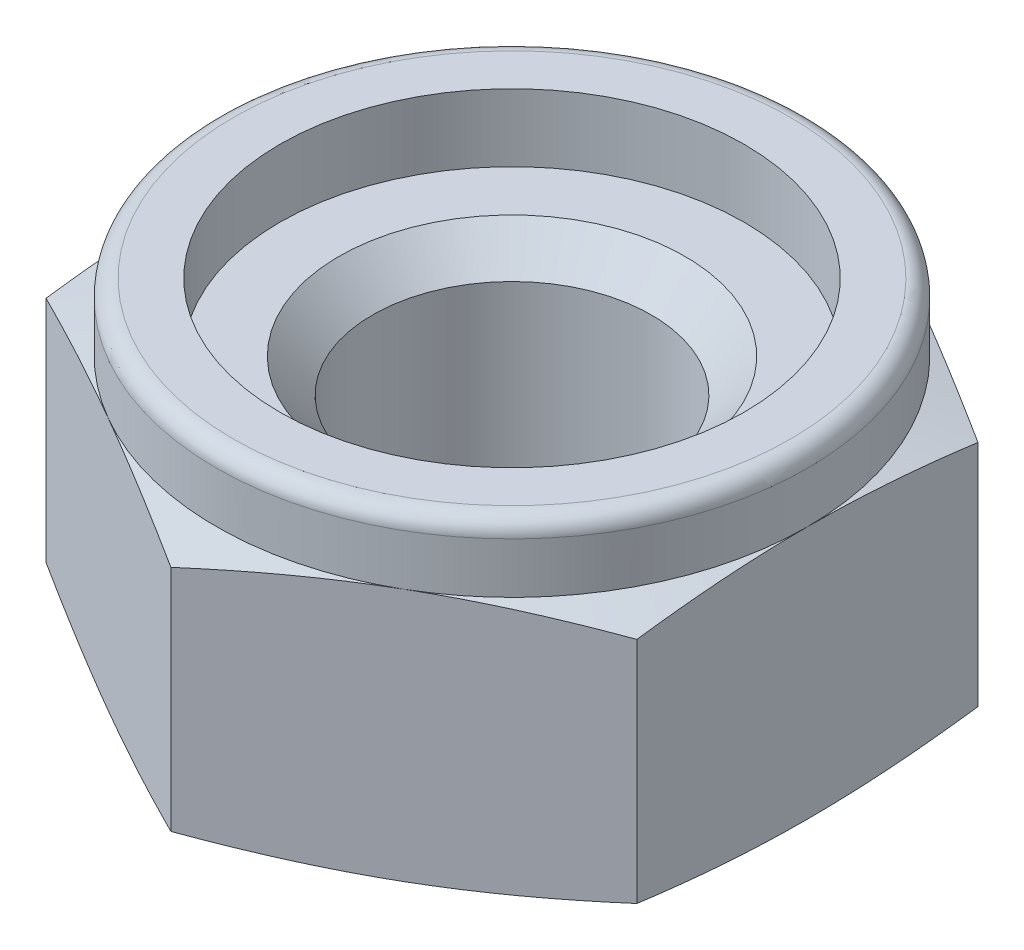
ISO-10303-21;
HEADER;
FILE_DESCRIPTION(('STEP AP214'),'2;1');
FILE_NAME('part.step','',(''),(''),'','','');
FILE_SCHEMA(('AUTOMOTIVE_DESIGN { 1 0 10303 214 1 1 1 1 }'));
ENDSEC;
DATA;
#1=APPLICATION_CONTEXT('core data for automotive mechanical design processes');
#2=APPLICATION_PROTOCOL_DEFINITION('international standard','automotive_design',2000,#1);
#3=PRODUCT_CONTEXT('',#1,'mechanical');
#4=PRODUCT('Part','Part','',(#3));
#5=PRODUCT_RELATED_PRODUCT_CATEGORY('part','',(#4));
#6=PRODUCT_DEFINITION_FORMATION('','',#4);
#7=PRODUCT_DEFINITION_CONTEXT('part definition',#1,'design');
#8=PRODUCT_DEFINITION('design','',#6,#7);
#9=PRODUCT_DEFINITION_SHAPE('','',#8);
#10=(LENGTH_UNIT() NAMED_UNIT(*) SI_UNIT(.MILLI.,.METRE.));
#11=(NAMED_UNIT(*) PLANE_ANGLE_UNIT() SI_UNIT($,.RADIAN.));
#12=(NAMED_UNIT(*) SI_UNIT($,.STERADIAN.) SOLID_ANGLE_UNIT());
#13=UNCERTAINTY_MEASURE_WITH_UNIT(LENGTH_MEASURE(1.E-05),#10,'distance_accuracy_value','');
#14=(GEOMETRIC_REPRESENTATION_CONTEXT(3) GLOBAL_UNCERTAINTY_ASSIGNED_CONTEXT((#13)) GLOBAL_UNIT_ASSIGNED_CONTEXT((#10,
#11,#12)) REPRESENTATION_CONTEXT('',''));
#15=CARTESIAN_POINT('',(0.,0.,0.));
#16=DIRECTION('',(0.,0.,1.));
#17=DIRECTION('',(1.,0.,0.));
#18=AXIS2_PLACEMENT_3D('',#15,#16,#17);
#19=CARTESIAN_POINT('',(3.5,-3.,-2.02072594216369));
#20=DIRECTION('',(0.5,0.,-0.866025403784438));
#21=DIRECTION('',(-0.866025403784439,0.,-0.5));
#22=AXIS2_PLACEMENT_3D('',#19,#20,#21);
#23=PLANE('',#22);
#24=DIRECTION('',(0.,1.,0.));
#25=VECTOR('',#24,1.);
#26=CARTESIAN_POINT('',(3.5,-3.,-2.02072594216369));
#27=LINE('',#26,#25);
#28=CARTESIAN_POINT('',(3.5,-2.85491840485417,-2.0207259421637));
#29=VERTEX_POINT('',#28);
#30=CARTESIAN_POINT('',(3.5,-0.145081595145828,-2.0207259421637));
#31=VERTEX_POINT('',#30);
#32=EDGE_CURVE('E159',#29,#31,#27,.T.);
#33=ORIENTED_EDGE('',*,*,#32,.F.);
#34=CARTESIAN_POINT('',(3.5002,-2.85488746342053,-2.02061047210985));
#35=CARTESIAN_POINT('',(3.35483723490565,-2.87738559382201,-2.10453570366722));
#36=CARTESIAN_POINT('',(3.20921089440683,-2.89781025450598,-2.18861311055532));
#37=CARTESIAN_POINT('',(2.91744387601656,-2.93369455339474,-2.3570648771636));
#38=CARTESIAN_POINT('',(2.77130301347336,-2.94915217450553,-2.44143934349252));
#39=CARTESIAN_POINT('',(2.47939308754756,-2.97419991225359,-2.6099736178049));
#40=CARTESIAN_POINT('',(2.33362599845102,-2.98381990209048,-2.69413228593378));
#41=CARTESIAN_POINT('',(2.04190591193726,-2.99671933246686,-2.86255695641052));
#42=CARTESIAN_POINT('',(1.89595295596863,-3.,-2.94682293482803));
#43=CARTESIAN_POINT('',(1.60404704403137,-3.,-3.11535489166305));
#44=CARTESIAN_POINT('',(1.45809408806274,-2.99671933246686,-3.19962087008056));
#45=CARTESIAN_POINT('',(1.16637400154898,-2.98381990209048,-3.3680455405573));
#46=CARTESIAN_POINT('',(1.02060691245245,-2.97419991225358,-3.45220420868617));
#47=CARTESIAN_POINT('',(0.728696986526637,-2.94915217450553,-3.62073848299856));
#48=CARTESIAN_POINT('',(0.582556123983439,-2.93369455339474,-3.70511294932748));
#49=CARTESIAN_POINT('',(0.290789105593174,-2.89781025450598,-3.87356471593575));
#50=CARTESIAN_POINT('',(0.145162765094348,-2.87738559382201,-3.95764212282385));
#51=CARTESIAN_POINT('',(-0.000199999999998899,-2.85488746342053,-4.04156735438122));
#52=B_SPLINE_CURVE_WITH_KNOTS('',3,(#34,#35,#36,#37,#38,#39,#40,#41,#42,#43,#44,#45,#46,#47,#48,
#49,#50,#51),.UNSPECIFIED.,.F.,.F.,(4,2,2,2,2,2,2,2,4),(0.,0.508081243376833,1.01636855642799,
1.52203235492776,2.02759827097034,2.53316418701292,3.03882798551268,3.54711529856384,
4.05519654194067),.UNSPECIFIED.);
#53=CARTESIAN_POINT('',(1.75,-3.,-3.03108891324554));
#54=VERTEX_POINT('',#53);
#55=EDGE_CURVE('E272',#29,#54,#52,.T.);
#56=ORIENTED_EDGE('',*,*,#55,.T.);
#57=CARTESIAN_POINT('',(0.,-2.85491840485417,-4.04145188432738));
#58=VERTEX_POINT('',#57);
#59=EDGE_CURVE('E57',#54,#58,#52,.T.);
#60=ORIENTED_EDGE('',*,*,#59,.T.);
#61=DIRECTION('',(0.,1.,0.));
#62=VECTOR('',#61,1.);
#63=CARTESIAN_POINT('',(0.,-3.,-4.04145188432738));
#64=LINE('',#63,#62);
#65=CARTESIAN_POINT('',(0.,-0.145081595145828,-4.04145188432738));
#66=VERTEX_POINT('',#65);
#67=EDGE_CURVE('E390',#58,#66,#64,.T.);
#68=ORIENTED_EDGE('',*,*,#67,.T.);
#69=CARTESIAN_POINT('',(-0.000200000000000184,-0.145112536579471,-4.04156735438122));
#70=CARTESIAN_POINT('',(0.145162765094346,-0.122614406177986,-3.95764212282385));
#71=CARTESIAN_POINT('',(0.290789105593173,-0.102189745494022,-3.87356471593576));
#72=CARTESIAN_POINT('',(0.582556123983438,-0.0663054466052643,-3.70511294932748));
#73=CARTESIAN_POINT('',(0.728696986526637,-0.0508478254944742,-3.62073848299856));
#74=CARTESIAN_POINT('',(1.02060691245244,-0.0258000877464157,-3.45220420868617));
#75=CARTESIAN_POINT('',(1.16637400154898,-0.0161800979095195,-3.3680455405573));
#76=CARTESIAN_POINT('',(1.45809408806274,-0.00328066753313903,-3.19962087008056));
#77=CARTESIAN_POINT('',(1.60404704403137,0.,-3.11535489166305));
#78=CARTESIAN_POINT('',(1.89595295596863,0.,-2.94682293482803));
#79=CARTESIAN_POINT('',(2.04190591193726,-0.00328066753313876,-2.86255695641052));
#80=CARTESIAN_POINT('',(2.33362599845102,-0.0161800979095192,-2.69413228593378));
#81=CARTESIAN_POINT('',(2.47939308754755,-0.0258000877464156,-2.6099736178049));
#82=CARTESIAN_POINT('',(2.77130301347336,-0.050847825494474,-2.44143934349252));
#83=CARTESIAN_POINT('',(2.91744387601656,-0.0663054466052638,-2.3570648771636));
#84=CARTESIAN_POINT('',(3.20921089440683,-0.102189745494021,-2.18861311055532));
#85=CARTESIAN_POINT('',(3.35483723490565,-0.122614406177985,-2.10453570366722));
#86=CARTESIAN_POINT('',(3.5002,-0.14511253657947,-2.02061047210985));
#87=B_SPLINE_CURVE_WITH_KNOTS('',3,(#69,#70,#71,#72,#73,#74,#75,#76,#77,#78,#79,#80,#81,#82,#83,
#84,#85,#86),.UNSPECIFIED.,.F.,.F.,(4,2,2,2,2,2,2,2,4),(0.,0.508081243376833,1.01636855642799,
1.52203235492776,2.02759827097034,2.53316418701292,3.03882798551268,3.54711529856384,
4.05519654194067),.UNSPECIFIED.);
#88=CARTESIAN_POINT('',(1.75,0.,-3.03108891324554));
#89=VERTEX_POINT('',#88);
#90=EDGE_CURVE('E394',#66,#89,#87,.T.);
#91=ORIENTED_EDGE('',*,*,#90,.T.);
#92=EDGE_CURVE('E236',#89,#31,#87,.T.);
#93=ORIENTED_EDGE('',*,*,#92,.T.);
#94=EDGE_LOOP('',(#33,#56,#60,#68,#91,#93));
#95=FACE_BOUND('',#94,.T.);
#96=ADVANCED_FACE('F34',(#95),#23,.T.);
#97=CARTESIAN_POINT('',(3.5,-3.,2.02072594216369));
#98=DIRECTION('',(1.,0.,0.));
#99=DIRECTION('',(0.,0.,-1.));
#100=AXIS2_PLACEMENT_3D('',#97,#98,#99);
#101=PLANE('',#100);
#102=DIRECTION('',(0.,1.,0.));
#103=VECTOR('',#102,1.);
#104=CARTESIAN_POINT('',(3.5,-3.,2.02072594216369));
#105=LINE('',#104,#103);
#106=CARTESIAN_POINT('',(3.50000000000001,-2.85491840485417,2.02072594216369));
#107=VERTEX_POINT('',#106);
#108=CARTESIAN_POINT('',(3.50000000000001,-0.145081595145828,2.02072594216369));
#109=VERTEX_POINT('',#108);
#110=EDGE_CURVE('E131',#107,#109,#105,.T.);
#111=ORIENTED_EDGE('',*,*,#110,.F.);
#112=CARTESIAN_POINT('',(3.5,-2.226460153703,-5.34250540243529));
#113=CARTESIAN_POINT('',(3.5,-2.26203237270815,-5.18375511671644));
#114=CARTESIAN_POINT('',(3.5,-2.29716837074254,-5.02490552043847));
#115=CARTESIAN_POINT('',(3.5,-2.36633415335759,-4.70695877225528));
#116=CARTESIAN_POINT('',(3.5,-2.40036389006764,-4.5478616099486));
#117=CARTESIAN_POINT('',(3.5,-2.46711307984257,-4.22922785596206));
#118=CARTESIAN_POINT('',(3.5,-2.4998312109674,-4.06969098596063));
#119=CARTESIAN_POINT('',(3.5,-2.56359691073799,-3.75028550399467));
#120=CARTESIAN_POINT('',(3.5,-2.59464449351522,-3.59041689484826));
#121=CARTESIAN_POINT('',(3.5,-2.68424317610052,-3.11278775858948));
#122=CARTESIAN_POINT('',(3.5,-2.7397960921004,-2.7944536274191));
#123=CARTESIAN_POINT('',(3.5,-2.83857753520242,-2.15584280750446));
#124=CARTESIAN_POINT('',(3.5,-2.88180820769069,-1.83556646684103));
#125=CARTESIAN_POINT('',(3.5,-2.93326780806071,-1.35186201394615));
#126=CARTESIAN_POINT('',(3.5,-2.94823562569858,-1.18915391181551));
#127=CARTESIAN_POINT('',(3.5,-2.97279914319906,-0.863327752554064));
#128=CARTESIAN_POINT('',(3.5,-2.98239496625829,-0.700209704910773));
#129=CARTESIAN_POINT('',(3.5,-2.99565632714604,-0.37380217752322));
#130=CARTESIAN_POINT('',(3.5,-2.99932454883453,-0.210512808879182));
#131=CARTESIAN_POINT('',(3.5,-3.00050481492705,0.116088611208561));
#132=CARTESIAN_POINT('',(3.5,-2.99801686409105,0.279400662634629));
#133=CARTESIAN_POINT('',(3.5,-2.98702500364934,0.606409684413189));
#134=CARTESIAN_POINT('',(3.5,-2.97849935713373,0.77010590916335));
#135=CARTESIAN_POINT('',(3.5,-2.95591780097622,1.09711815279145));
#136=CARTESIAN_POINT('',(3.5,-2.94186159147595,1.26043415057105));
#137=CARTESIAN_POINT('',(3.5,-2.90892981836055,1.58667719858699));
#138=CARTESIAN_POINT('',(3.5,-2.89005119345729,1.74960393516029));
#139=CARTESIAN_POINT('',(3.5,-2.84825406645032,2.07493184102748));
#140=CARTESIAN_POINT('',(3.5,-2.82533555169116,2.23733300867335));
#141=CARTESIAN_POINT('',(3.5,-2.75494463873052,2.7020124428008));
#142=CARTESIAN_POINT('',(3.5,-2.70339226790375,3.00366965520128));
#143=CARTESIAN_POINT('',(3.5,-2.59266255628891,3.60558094545379));
#144=CARTESIAN_POINT('',(3.5,-2.5334842530017,3.90583484122204));
#145=CARTESIAN_POINT('',(3.5,-2.41000595354002,4.50535507961957));
#146=CARTESIAN_POINT('',(3.5,-2.34570472614207,4.80462116673555));
#147=CARTESIAN_POINT('',(3.5,-2.21361575047093,5.40235855476505));
#148=CARTESIAN_POINT('',(3.5,-2.14582820521406,5.70082990089599));
#149=CARTESIAN_POINT('',(3.5,-2.0084804326362,6.29427282929031));
#150=CARTESIAN_POINT('',(3.5,-1.93894417301507,6.58924997937445));
#151=CARTESIAN_POINT('',(3.5,-1.79812969725047,7.17879272941703));
#152=CARTESIAN_POINT('',(3.5,-1.72685144950579,7.47335832180682));
#153=CARTESIAN_POINT('',(3.5,-1.58309646585873,8.06181238798382));
#154=CARTESIAN_POINT('',(3.5,-1.5106213116643,8.35570124898793));
#155=CARTESIAN_POINT('',(3.5,-1.3646806148985,8.94322286292842));
#156=CARTESIAN_POINT('',(3.5,-1.29121510501221,9.23685562397808));
#157=CARTESIAN_POINT('',(3.5,-1.21739870980131,9.53039909334217));
#158=B_SPLINE_CURVE_WITH_KNOTS('',3,(#112,#113,#114,#115,#116,#117,#118,#119,#120,#121,#122,
#123,#124,#125,#126,#127,#128,#129,#130,#131,#132,#133,#134,#135,#136,#137,#138,#139,#140,#141,
#142,#143,#144,#145,#146,#147,#148,#149,#150,#151,#152,#153,#154,#155,#156,#157),.UNSPECIFIED.,
.F.,.F.,(4,2,2,2,2,2,2,2,2,2,2,2,2,2,2,2,2,2,2,2,2,2,4),(0.,0.488062347012478,0.97614578563109,
1.46470938191903,1.95326884470765,2.92256552954152,3.8916933500248,4.38180449892748,
4.8719044075891,5.36178234983076,5.85165991329731,6.34331015910023,6.83498706507532,
7.32697686849975,7.8189682131699,8.73688794577191,9.65492364634102,10.5731806534719,
11.491384248794,12.4005642685826,13.3097607939584,14.2178391858651,15.1258876811447),.UNSPECIFIED.);
#159=CARTESIAN_POINT('',(3.5,-3.,0.));
#160=VERTEX_POINT('',#159);
#161=EDGE_CURVE('E252',#107,#160,#158,.F.);
#162=ORIENTED_EDGE('',*,*,#161,.T.);
#163=EDGE_CURVE('E49',#160,#29,#158,.F.);
#164=ORIENTED_EDGE('',*,*,#163,.T.);
#165=ORIENTED_EDGE('',*,*,#32,.T.);
#166=CARTESIAN_POINT('',(3.5,-0.773539846297001,-5.34250540243529));
#167=CARTESIAN_POINT('',(3.5,-0.737967627291851,-5.18375511671644));
#168=CARTESIAN_POINT('',(3.5,-0.702831629257461,-5.02490552043847));
#169=CARTESIAN_POINT('',(3.5,-0.633665846642409,-4.70695877225528));
#170=CARTESIAN_POINT('',(3.5,-0.599636109932362,-4.5478616099486));
#171=CARTESIAN_POINT('',(3.5,-0.53288692015743,-4.22922785596206));
#172=CARTESIAN_POINT('',(3.5,-0.500168789032601,-4.06969098596063));
#173=CARTESIAN_POINT('',(3.5,-0.436403089262015,-3.75028550399467));
#174=CARTESIAN_POINT('',(3.5,-0.405355506484781,-3.59041689484826));
#175=CARTESIAN_POINT('',(3.5,-0.315756823899478,-3.11278775858948));
#176=CARTESIAN_POINT('',(3.5,-0.260203907899604,-2.7944536274191));
#177=CARTESIAN_POINT('',(3.5,-0.161422464797579,-2.15584280750445));
#178=CARTESIAN_POINT('',(3.5,-0.118191792309313,-1.83556646684103));
#179=CARTESIAN_POINT('',(3.5,-0.0667321919392874,-1.35186201394615));
#180=CARTESIAN_POINT('',(3.5,-0.0517643743014151,-1.18915391181551));
#181=CARTESIAN_POINT('',(3.5,-0.0272008568009372,-0.863327752554063));
#182=CARTESIAN_POINT('',(3.5,-0.0176050337417049,-0.700209704910772));
#183=CARTESIAN_POINT('',(3.5,-0.00434367285395687,-0.373802177523219));
#184=CARTESIAN_POINT('',(3.5,-0.000675451165470051,-0.210512808879181));
#185=CARTESIAN_POINT('',(3.5,0.000504814927045224,0.11608861120856));
#186=CARTESIAN_POINT('',(3.5,-0.00198313590895361,0.279400662634628));
#187=CARTESIAN_POINT('',(3.5,-0.0129749963506569,0.606409684413189));
#188=CARTESIAN_POINT('',(3.5,-0.0215006428662734,0.770105909163349));
#189=CARTESIAN_POINT('',(3.5,-0.044082199023783,1.09711815279145));
#190=CARTESIAN_POINT('',(3.5,-0.0581384085240471,1.26043415057105));
#191=CARTESIAN_POINT('',(3.5,-0.0910701816394463,1.58667719858699));
#192=CARTESIAN_POINT('',(3.5,-0.109948806542714,1.74960393516029));
#193=CARTESIAN_POINT('',(3.5,-0.151745933549684,2.07493184102748));
#194=CARTESIAN_POINT('',(3.5,-0.174664448308837,2.23733300867335));
#195=CARTESIAN_POINT('',(3.5,-0.245055361269475,2.7020124428008));
#196=CARTESIAN_POINT('',(3.5,-0.296607732096252,3.00366965520128));
#197=CARTESIAN_POINT('',(3.5,-0.407337443711091,3.60558094545379));
#198=CARTESIAN_POINT('',(3.5,-0.466515746998305,3.90583484122204));
#199=CARTESIAN_POINT('',(3.5,-0.589994046459978,4.50535507961957));
#200=CARTESIAN_POINT('',(3.5,-0.654295273857928,4.80462116673556));
#201=CARTESIAN_POINT('',(3.5,-0.786384249529069,5.40235855476505));
#202=CARTESIAN_POINT('',(3.5,-0.854171794785942,5.70082990089599));
#203=CARTESIAN_POINT('',(3.5,-0.991519567363798,6.29427282929031));
#204=CARTESIAN_POINT('',(3.5,-1.06105582698493,6.58924997937445));
#205=CARTESIAN_POINT('',(3.5,-1.20187030274953,7.17879272941703));
#206=CARTESIAN_POINT('',(3.5,-1.27314855049421,7.47335832180682));
#207=CARTESIAN_POINT('',(3.5,-1.41690353414126,8.06181238798382));
#208=CARTESIAN_POINT('',(3.5,-1.48937868833569,8.35570124898793));
#209=CARTESIAN_POINT('',(3.5,-1.63531938510149,8.94322286292842));
#210=CARTESIAN_POINT('',(3.5,-1.70878489498779,9.23685562397808));
#211=CARTESIAN_POINT('',(3.5,-1.78260129019869,9.53039909334217));
#212=B_SPLINE_CURVE_WITH_KNOTS('',3,(#166,#167,#168,#169,#170,#171,#172,#173,#174,#175,#176,
#177,#178,#179,#180,#181,#182,#183,#184,#185,#186,#187,#188,#189,#190,#191,#192,#193,#194,#195,
#196,#197,#198,#199,#200,#201,#202,#203,#204,#205,#206,#207,#208,#209,#210,#211),.UNSPECIFIED.,
.F.,.F.,(4,2,2,2,2,2,2,2,2,2,2,2,2,2,2,2,2,2,2,2,2,2,4),(0.,0.488062347012478,0.97614578563109,
1.46470938191903,1.95326884470766,2.92256552954152,3.8916933500248,4.38180449892748,
4.8719044075891,5.36178234983076,5.85165991329731,6.34331015910023,6.83498706507532,
7.32697686849975,7.8189682131699,8.73688794577191,9.65492364634102,10.5731806534719,
11.491384248794,12.4005642685826,13.3097607939584,14.2178391858651,15.1258876811447),.UNSPECIFIED.);
#213=CARTESIAN_POINT('',(3.5,0.,0.));
#214=VERTEX_POINT('',#213);
#215=EDGE_CURVE('E235',#31,#214,#212,.T.);
#216=ORIENTED_EDGE('',*,*,#215,.T.);
#217=EDGE_CURVE('E135',#214,#109,#212,.T.);
#218=ORIENTED_EDGE('',*,*,#217,.T.);
#219=EDGE_LOOP('',(#111,#162,#164,#165,#216,#218));
#220=FACE_BOUND('',#219,.T.);
#221=ADVANCED_FACE('F240',(#220),#101,.T.);
#222=CARTESIAN_POINT('',(0.,-3.,4.04145188432738));
#223=DIRECTION('',(0.5,0.,0.866025403784439));
#224=DIRECTION('',(0.866025403784439,0.,-0.5));
#225=AXIS2_PLACEMENT_3D('',#222,#223,#224);
#226=PLANE('',#225);
#227=DIRECTION('',(0.,1.,0.));
#228=VECTOR('',#227,1.);
#229=CARTESIAN_POINT('',(0.,-3.,4.04145188432738));
#230=LINE('',#229,#228);
#231=CARTESIAN_POINT('',(0.,-2.85491840485417,4.04145188432738));
#232=VERTEX_POINT('',#231);
#233=CARTESIAN_POINT('',(0.,-0.145081595145828,4.04145188432738));
#234=VERTEX_POINT('',#233);
#235=EDGE_CURVE('E392',#232,#234,#230,.T.);
#236=ORIENTED_EDGE('',*,*,#235,.F.);
#237=CARTESIAN_POINT('',(-0.000200000000001226,-2.85488746342053,4.04156735438122));
#238=CARTESIAN_POINT('',(0.145162765094346,-2.87738559382202,3.95764212282385));
#239=CARTESIAN_POINT('',(0.290789105593172,-2.89781025450598,3.87356471593575));
#240=CARTESIAN_POINT('',(0.582556123983437,-2.93369455339474,3.70511294932748));
#241=CARTESIAN_POINT('',(0.728696986526636,-2.94915217450553,3.62073848299856));
#242=CARTESIAN_POINT('',(1.02060691245244,-2.97419991225359,3.45220420868617));
#243=CARTESIAN_POINT('',(1.16637400154898,-2.98381990209048,3.3680455405573));
#244=CARTESIAN_POINT('',(1.45809408806274,-2.99671933246686,3.19962087008055));
#245=CARTESIAN_POINT('',(1.60404704403137,-3.,3.11535489166304));
#246=CARTESIAN_POINT('',(1.89595295596863,-3.,2.94682293482803));
#247=CARTESIAN_POINT('',(2.04190591193726,-2.99671933246686,2.86255695641052));
#248=CARTESIAN_POINT('',(2.33362599845102,-2.98381990209048,2.69413228593377));
#249=CARTESIAN_POINT('',(2.47939308754755,-2.97419991225359,2.6099736178049));
#250=CARTESIAN_POINT('',(2.77130301347336,-2.94915217450553,2.44143934349251));
#251=CARTESIAN_POINT('',(2.91744387601656,-2.93369455339474,2.35706487716359));
#252=CARTESIAN_POINT('',(3.20921089440683,-2.89781025450598,2.18861311055532));
#253=CARTESIAN_POINT('',(3.35483723490565,-2.87738559382201,2.10453570366722));
#254=CARTESIAN_POINT('',(3.5002,-2.85488746342053,2.02061047210985));
#255=B_SPLINE_CURVE_WITH_KNOTS('',3,(#237,#238,#239,#240,#241,#242,#243,#244,#245,#246,#247,
#248,#249,#250,#251,#252,#253,#254),.UNSPECIFIED.,.F.,.F.,(4,2,2,2,2,2,2,2,4),(0.,
0.508081243376834,1.01636855642799,1.52203235492776,2.02759827097034,2.53316418701292,
3.03882798551268,3.54711529856384,4.05519654194067),.UNSPECIFIED.);
#256=CARTESIAN_POINT('',(1.75,-3.,3.03108891324554));
#257=VERTEX_POINT('',#256);
#258=EDGE_CURVE('E152',#232,#257,#255,.T.);
#259=ORIENTED_EDGE('',*,*,#258,.T.);
#260=EDGE_CURVE('E258',#257,#107,#255,.T.);
#261=ORIENTED_EDGE('',*,*,#260,.T.);
#262=ORIENTED_EDGE('',*,*,#110,.T.);
#263=CARTESIAN_POINT('',(3.5002,-0.14511253657947,2.02061047210985));
#264=CARTESIAN_POINT('',(3.35483723490565,-0.122614406177985,2.10453570366722));
#265=CARTESIAN_POINT('',(3.20921089440683,-0.102189745494021,2.18861311055532));
#266=CARTESIAN_POINT('',(2.91744387601656,-0.0663054466052634,2.35706487716359));
#267=CARTESIAN_POINT('',(2.77130301347336,-0.0508478254944735,2.44143934349251));
#268=CARTESIAN_POINT('',(2.47939308754755,-0.0258000877464149,2.6099736178049));
#269=CARTESIAN_POINT('',(2.33362599845102,-0.0161800979095184,2.69413228593377));
#270=CARTESIAN_POINT('',(2.04190591193726,-0.00328066753313806,2.86255695641052));
#271=CARTESIAN_POINT('',(1.89595295596863,0.,2.94682293482803));
#272=CARTESIAN_POINT('',(1.60404704403137,0.,3.11535489166304));
#273=CARTESIAN_POINT('',(1.45809408806274,-0.00328066753313799,3.19962087008055));
#274=CARTESIAN_POINT('',(1.16637400154898,-0.0161800979095183,3.3680455405573));
#275=CARTESIAN_POINT('',(1.02060691245244,-0.0258000877464148,3.45220420868617));
#276=CARTESIAN_POINT('',(0.728696986526636,-0.0508478254944733,3.62073848299856));
#277=CARTESIAN_POINT('',(0.582556123983437,-0.0663054466052632,3.70511294932748));
#278=CARTESIAN_POINT('',(0.290789105593171,-0.102189745494021,3.87356471593575));
#279=CARTESIAN_POINT('',(0.145162765094345,-0.122614406177984,3.95764212282385));
#280=CARTESIAN_POINT('',(-0.000200000000001188,-0.14511253657947,4.04156735438122));
#281=B_SPLINE_CURVE_WITH_KNOTS('',3,(#263,#264,#265,#266,#267,#268,#269,#270,#271,#272,#273,
#274,#275,#276,#277,#278,#279,#280),.UNSPECIFIED.,.F.,.F.,(4,2,2,2,2,2,2,2,4),(0.,
0.508081243376833,1.016368556428,1.52203235492776,2.02759827097034,2.53316418701292,
3.03882798551268,3.54711529856384,4.05519654194067),.UNSPECIFIED.);
#282=CARTESIAN_POINT('',(1.75,0.,3.03108891324554));
#283=VERTEX_POINT('',#282);
#284=EDGE_CURVE('E124',#109,#283,#281,.T.);
#285=ORIENTED_EDGE('',*,*,#284,.T.);
#286=EDGE_CURVE('E128',#283,#234,#281,.T.);
#287=ORIENTED_EDGE('',*,*,#286,.T.);
#288=EDGE_LOOP('',(#236,#259,#261,#262,#285,#287));
#289=FACE_BOUND('',#288,.T.);
#290=ADVANCED_FACE('F127',(#289),#226,.T.);
#291=CARTESIAN_POINT('',(-3.5,-3.,2.02072594216369));
#292=DIRECTION('',(-0.5,0.,0.866025403784438));
#293=DIRECTION('',(0.866025403784439,0.,0.5));
#294=AXIS2_PLACEMENT_3D('',#291,#292,#293);
#295=PLANE('',#294);
#296=DIRECTION('',(0.,1.,0.));
#297=VECTOR('',#296,1.);
#298=CARTESIAN_POINT('',(-3.5,-3.,2.02072594216369));
#299=LINE('',#298,#297);
#300=CARTESIAN_POINT('',(-3.5,-2.85491840485417,2.02072594216369));
#301=VERTEX_POINT('',#300);
#302=CARTESIAN_POINT('',(-3.5,-0.145081595145828,2.02072594216369));
#303=VERTEX_POINT('',#302);
#304=EDGE_CURVE('E389',#301,#303,#299,.T.);
#305=ORIENTED_EDGE('',*,*,#304,.F.);
#306=CARTESIAN_POINT('',(-3.5002,-2.85488746342053,2.02061047210985));
#307=CARTESIAN_POINT('',(-3.35483723490565,-2.87738559382202,2.10453570366722));
#308=CARTESIAN_POINT('',(-3.20921089440683,-2.89781025450598,2.18861311055532));
#309=CARTESIAN_POINT('',(-2.91744387601656,-2.93369455339474,2.35706487716359));
#310=CARTESIAN_POINT('',(-2.77130301347336,-2.94915217450553,2.44143934349251));
#311=CARTESIAN_POINT('',(-2.47939308754756,-2.97419991225359,2.6099736178049));
#312=CARTESIAN_POINT('',(-2.33362599845102,-2.98381990209048,2.69413228593377));
#313=CARTESIAN_POINT('',(-2.04190591193726,-2.99671933246686,2.86255695641052));
#314=CARTESIAN_POINT('',(-1.89595295596863,-3.,2.94682293482802));
#315=CARTESIAN_POINT('',(-1.60404704403137,-3.,3.11535489166304));
#316=CARTESIAN_POINT('',(-1.45809408806274,-2.99671933246686,3.19962087008055));
#317=CARTESIAN_POINT('',(-1.16637400154898,-2.98381990209048,3.3680455405573));
#318=CARTESIAN_POINT('',(-1.02060691245245,-2.97419991225359,3.45220420868617));
#319=CARTESIAN_POINT('',(-0.728696986526637,-2.94915217450553,3.62073848299856));
#320=CARTESIAN_POINT('',(-0.582556123983439,-2.93369455339474,3.70511294932748));
#321=CARTESIAN_POINT('',(-0.290789105593174,-2.89781025450598,3.87356471593575));
#322=CARTESIAN_POINT('',(-0.145162765094348,-2.87738559382202,3.95764212282385));
#323=CARTESIAN_POINT('',(0.000199999999999054,-2.85488746342053,4.04156735438122));
#324=B_SPLINE_CURVE_WITH_KNOTS('',3,(#306,#307,#308,#309,#310,#311,#312,#313,#314,#315,#316,
#317,#318,#319,#320,#321,#322,#323),.UNSPECIFIED.,.F.,.F.,(4,2,2,2,2,2,2,2,4),(0.,
0.508081243376834,1.016368556428,1.52203235492776,2.02759827097034,2.53316418701292,
3.03882798551268,3.54711529856384,4.05519654194067),.UNSPECIFIED.);
#325=CARTESIAN_POINT('',(-1.75,-3.,3.03108891324554));
#326=VERTEX_POINT('',#325);
#327=EDGE_CURVE('E253',#301,#326,#324,.T.);
#328=ORIENTED_EDGE('',*,*,#327,.T.);
#329=EDGE_CURVE('E262',#326,#232,#324,.T.);
#330=ORIENTED_EDGE('',*,*,#329,.T.);
#331=ORIENTED_EDGE('',*,*,#235,.T.);
#332=CARTESIAN_POINT('',(0.000199999999998816,-0.14511253657947,4.04156735438122));
#333=CARTESIAN_POINT('',(-0.145162765094348,-0.122614406177984,3.95764212282385));
#334=CARTESIAN_POINT('',(-0.290789105593174,-0.102189745494021,3.87356471593575));
#335=CARTESIAN_POINT('',(-0.582556123983439,-0.0663054466052633,3.70511294932748));
#336=CARTESIAN_POINT('',(-0.728696986526638,-0.0508478254944734,3.62073848299856));
#337=CARTESIAN_POINT('',(-1.02060691245245,-0.0258000877464149,3.45220420868617));
#338=CARTESIAN_POINT('',(-1.16637400154898,-0.0161800979095184,3.3680455405573));
#339=CARTESIAN_POINT('',(-1.45809408806274,-0.00328066753313807,3.19962087008055));
#340=CARTESIAN_POINT('',(-1.60404704403137,0.,3.11535489166304));
#341=CARTESIAN_POINT('',(-1.89595295596863,0.,2.94682293482802));
#342=CARTESIAN_POINT('',(-2.04190591193726,-0.00328066753313804,2.86255695641051));
#343=CARTESIAN_POINT('',(-2.33362599845102,-0.0161800979095185,2.69413228593377));
#344=CARTESIAN_POINT('',(-2.47939308754756,-0.0258000877464149,2.6099736178049));
#345=CARTESIAN_POINT('',(-2.77130301347336,-0.0508478254944735,2.44143934349251));
#346=CARTESIAN_POINT('',(-2.91744387601656,-0.0663054466052634,2.35706487716359));
#347=CARTESIAN_POINT('',(-3.20921089440683,-0.102189745494021,2.18861311055532));
#348=CARTESIAN_POINT('',(-3.35483723490565,-0.122614406177985,2.10453570366722));
#349=CARTESIAN_POINT('',(-3.5002,-0.14511253657947,2.02061047210985));
#350=B_SPLINE_CURVE_WITH_KNOTS('',3,(#332,#333,#334,#335,#336,#337,#338,#339,#340,#341,#342,
#343,#344,#345,#346,#347,#348,#349),.UNSPECIFIED.,.F.,.F.,(4,2,2,2,2,2,2,2,4),(0.,
0.508081243376834,1.01636855642799,1.52203235492776,2.02759827097034,2.53316418701292,
3.03882798551268,3.54711529856384,4.05519654194067),.UNSPECIFIED.);
#351=CARTESIAN_POINT('',(-1.75,0.,3.03108891324554));
#352=VERTEX_POINT('',#351);
#353=EDGE_CURVE('E144',#234,#352,#350,.T.);
#354=ORIENTED_EDGE('',*,*,#353,.T.);
#355=EDGE_CURVE('E221',#352,#303,#350,.T.);
#356=ORIENTED_EDGE('',*,*,#355,.T.);
#357=EDGE_LOOP('',(#305,#328,#330,#331,#354,#356));
#358=FACE_BOUND('',#357,.T.);
#359=ADVANCED_FACE('F380',(#358),#295,.T.);
#360=CARTESIAN_POINT('',(-3.5,-3.,-2.02072594216369));
#361=DIRECTION('',(-1.,0.,0.));
#362=DIRECTION('',(0.,0.,1.));
#363=AXIS2_PLACEMENT_3D('',#360,#361,#362);
#364=PLANE('',#363);
#365=DIRECTION('',(0.,1.,0.));
#366=VECTOR('',#365,1.);
#367=CARTESIAN_POINT('',(-3.5,-3.,-2.02072594216369));
#368=LINE('',#367,#366);
#369=CARTESIAN_POINT('',(-3.5,-2.85491840485417,-2.02072594216369));
#370=VERTEX_POINT('',#369);
#371=CARTESIAN_POINT('',(-3.5,-0.145081595145828,-2.02072594216369));
#372=VERTEX_POINT('',#371);
#373=EDGE_CURVE('E187',#370,#372,#368,.T.);
#374=ORIENTED_EDGE('',*,*,#373,.F.);
#375=CARTESIAN_POINT('',(-3.5,-2.226460153703,-5.34250540243529));
#376=CARTESIAN_POINT('',(-3.5,-2.26203237270815,-5.18375511671645));
#377=CARTESIAN_POINT('',(-3.5,-2.29716837074254,-5.02490552043848));
#378=CARTESIAN_POINT('',(-3.5,-2.36633415335759,-4.70695877225528));
#379=CARTESIAN_POINT('',(-3.5,-2.40036389006764,-4.5478616099486));
#380=CARTESIAN_POINT('',(-3.5,-2.46711307984257,-4.22922785596207));
#381=CARTESIAN_POINT('',(-3.5,-2.4998312109674,-4.06969098596063));
#382=CARTESIAN_POINT('',(-3.5,-2.56359691073798,-3.75028550399467));
#383=CARTESIAN_POINT('',(-3.5,-2.59464449351522,-3.59041689484827));
#384=CARTESIAN_POINT('',(-3.5,-2.68424317610052,-3.11278775858948));
#385=CARTESIAN_POINT('',(-3.5,-2.7397960921004,-2.7944536274191));
#386=CARTESIAN_POINT('',(-3.5,-2.83857753520242,-2.15584280750446));
#387=CARTESIAN_POINT('',(-3.5,-2.88180820769069,-1.83556646684103));
#388=CARTESIAN_POINT('',(-3.5,-2.93326780806071,-1.35186201394615));
#389=CARTESIAN_POINT('',(-3.5,-2.94823562569858,-1.18915391181551));
#390=CARTESIAN_POINT('',(-3.5,-2.97279914319906,-0.863327752554064));
#391=CARTESIAN_POINT('',(-3.5,-2.98239496625829,-0.700209704910773));
#392=CARTESIAN_POINT('',(-3.5,-2.99565632714604,-0.37380217752322));
#393=CARTESIAN_POINT('',(-3.5,-2.99932454883453,-0.210512808879182));
#394=CARTESIAN_POINT('',(-3.5,-3.00050481492704,0.116088611208561));
#395=CARTESIAN_POINT('',(-3.5,-2.99801686409105,0.279400662634629));
#396=CARTESIAN_POINT('',(-3.5,-2.98702500364934,0.606409684413189));
#397=CARTESIAN_POINT('',(-3.5,-2.97849935713373,0.77010590916335));
#398=CARTESIAN_POINT('',(-3.5,-2.95591780097622,1.09711815279145));
#399=CARTESIAN_POINT('',(-3.5,-2.94186159147595,1.26043415057105));
#400=CARTESIAN_POINT('',(-3.5,-2.90892981836055,1.58667719858699));
#401=CARTESIAN_POINT('',(-3.5,-2.89005119345729,1.74960393516029));
#402=CARTESIAN_POINT('',(-3.5,-2.84825406645032,2.07493184102748));
#403=CARTESIAN_POINT('',(-3.5,-2.82533555169116,2.23733300867335));
#404=CARTESIAN_POINT('',(-3.5,-2.75494463873052,2.7020124428008));
#405=CARTESIAN_POINT('',(-3.5,-2.70339226790375,3.00366965520128));
#406=CARTESIAN_POINT('',(-3.5,-2.59266255628891,3.60558094545379));
#407=CARTESIAN_POINT('',(-3.5,-2.53348425300169,3.90583484122204));
#408=CARTESIAN_POINT('',(-3.5,-2.41000595354002,4.50535507961957));
#409=CARTESIAN_POINT('',(-3.5,-2.34570472614207,4.80462116673556));
#410=CARTESIAN_POINT('',(-3.5,-2.21361575047093,5.40235855476505));
#411=CARTESIAN_POINT('',(-3.5,-2.14582820521406,5.70082990089599));
#412=CARTESIAN_POINT('',(-3.5,-2.0084804326362,6.29427282929031));
#413=CARTESIAN_POINT('',(-3.5,-1.93894417301507,6.58924997937445));
#414=CARTESIAN_POINT('',(-3.5,-1.79812969725046,7.17879272941703));
#415=CARTESIAN_POINT('',(-3.5,-1.72685144950579,7.47335832180682));
#416=CARTESIAN_POINT('',(-3.5,-1.58309646585874,8.06181238798382));
#417=CARTESIAN_POINT('',(-3.5,-1.51062131166431,8.35570124898792));
#418=CARTESIAN_POINT('',(-3.5,-1.36468061489851,8.94322286292842));
#419=CARTESIAN_POINT('',(-3.5,-1.29121510501221,9.23685562397808));
#420=CARTESIAN_POINT('',(-3.5,-1.21739870980131,9.53039909334217));
#421=B_SPLINE_CURVE_WITH_KNOTS('',3,(#375,#376,#377,#378,#379,#380,#381,#382,#383,#384,#385,
#386,#387,#388,#389,#390,#391,#392,#393,#394,#395,#396,#397,#398,#399,#400,#401,#402,#403,#404,
#405,#406,#407,#408,#409,#410,#411,#412,#413,#414,#415,#416,#417,#418,#419,#420),.UNSPECIFIED.,
.F.,.F.,(4,2,2,2,2,2,2,2,2,2,2,2,2,2,2,2,2,2,2,2,2,2,4),(0.,0.488062347012477,0.976145785631089,
1.46470938191903,1.95326884470766,2.92256552954152,3.8916933500248,4.38180449892748,
4.8719044075891,5.36178234983076,5.85165991329732,6.34331015910024,6.83498706507533,
7.32697686849976,7.81896821316991,8.73688794577192,9.65492364634102,10.5731806534719,
11.491384248794,12.4005642685826,13.3097607939584,14.2178391858651,15.1258876811447),.UNSPECIFIED.);
#422=CARTESIAN_POINT('',(-3.5,-3.,0.));
#423=VERTEX_POINT('',#422);
#424=EDGE_CURVE('E274',#370,#423,#421,.T.);
#425=ORIENTED_EDGE('',*,*,#424,.T.);
#426=EDGE_CURVE('E269',#423,#301,#421,.T.);
#427=ORIENTED_EDGE('',*,*,#426,.T.);
#428=ORIENTED_EDGE('',*,*,#304,.T.);
#429=CARTESIAN_POINT('',(-3.5,-0.773539846297001,-5.34250540243529));
#430=CARTESIAN_POINT('',(-3.5,-0.737967627291852,-5.18375511671645));
#431=CARTESIAN_POINT('',(-3.5,-0.702831629257461,-5.02490552043847));
#432=CARTESIAN_POINT('',(-3.5,-0.63366584664241,-4.70695877225528));
#433=CARTESIAN_POINT('',(-3.5,-0.599636109932363,-4.5478616099486));
#434=CARTESIAN_POINT('',(-3.5,-0.532886920157431,-4.22922785596207));
#435=CARTESIAN_POINT('',(-3.5,-0.500168789032602,-4.06969098596063));
#436=CARTESIAN_POINT('',(-3.5,-0.436403089262015,-3.75028550399467));
#437=CARTESIAN_POINT('',(-3.5,-0.405355506484782,-3.59041689484827));
#438=CARTESIAN_POINT('',(-3.5,-0.315756823899479,-3.11278775858948));
#439=CARTESIAN_POINT('',(-3.5,-0.260203907899604,-2.7944536274191));
#440=CARTESIAN_POINT('',(-3.5,-0.161422464797579,-2.15584280750446));
#441=CARTESIAN_POINT('',(-3.5,-0.118191792309313,-1.83556646684103));
#442=CARTESIAN_POINT('',(-3.5,-0.0667321919392877,-1.35186201394615));
#443=CARTESIAN_POINT('',(-3.5,-0.0517643743014153,-1.18915391181551));
#444=CARTESIAN_POINT('',(-3.5,-0.0272008568009374,-0.863327752554063));
#445=CARTESIAN_POINT('',(-3.5,-0.0176050337417051,-0.700209704910773));
#446=CARTESIAN_POINT('',(-3.5,-0.00434367285395706,-0.37380217752322));
#447=CARTESIAN_POINT('',(-3.5,-0.000675451165470236,-0.210512808879181));
#448=CARTESIAN_POINT('',(-3.5,0.000504814927045058,0.116088611208561));
#449=CARTESIAN_POINT('',(-3.5,-0.00198313590895376,0.279400662634629));
#450=CARTESIAN_POINT('',(-3.5,-0.012974996350657,0.606409684413189));
#451=CARTESIAN_POINT('',(-3.5,-0.0215006428662735,0.77010590916335));
#452=CARTESIAN_POINT('',(-3.5,-0.0440821990237832,1.09711815279145));
#453=CARTESIAN_POINT('',(-3.5,-0.0581384085240473,1.26043415057105));
#454=CARTESIAN_POINT('',(-3.5,-0.0910701816394466,1.58667719858699));
#455=CARTESIAN_POINT('',(-3.5,-0.109948806542714,1.74960393516029));
#456=CARTESIAN_POINT('',(-3.5,-0.151745933549684,2.07493184102748));
#457=CARTESIAN_POINT('',(-3.5,-0.174664448308837,2.23733300867335));
#458=CARTESIAN_POINT('',(-3.5,-0.245055361269475,2.7020124428008));
#459=CARTESIAN_POINT('',(-3.5,-0.296607732096253,3.00366965520128));
#460=CARTESIAN_POINT('',(-3.5,-0.407337443711091,3.60558094545379));
#461=CARTESIAN_POINT('',(-3.5,-0.466515746998305,3.90583484122204));
#462=CARTESIAN_POINT('',(-3.5,-0.589994046459978,4.50535507961957));
#463=CARTESIAN_POINT('',(-3.5,-0.654295273857928,4.80462116673555));
#464=CARTESIAN_POINT('',(-3.5,-0.786384249529068,5.40235855476505));
#465=CARTESIAN_POINT('',(-3.5,-0.854171794785941,5.70082990089599));
#466=CARTESIAN_POINT('',(-3.5,-0.991519567363798,6.29427282929031));
#467=CARTESIAN_POINT('',(-3.5,-1.06105582698493,6.58924997937445));
#468=CARTESIAN_POINT('',(-3.5,-1.20187030274953,7.17879272941703));
#469=CARTESIAN_POINT('',(-3.5,-1.27314855049421,7.47335832180682));
#470=CARTESIAN_POINT('',(-3.5,-1.41690353414126,8.06181238798382));
#471=CARTESIAN_POINT('',(-3.5,-1.48937868833569,8.35570124898793));
#472=CARTESIAN_POINT('',(-3.5,-1.63531938510149,8.94322286292842));
#473=CARTESIAN_POINT('',(-3.5,-1.70878489498779,9.23685562397808));
#474=CARTESIAN_POINT('',(-3.5,-1.78260129019869,9.53039909334217));
#475=B_SPLINE_CURVE_WITH_KNOTS('',3,(#429,#430,#431,#432,#433,#434,#435,#436,#437,#438,#439,
#440,#441,#442,#443,#444,#445,#446,#447,#448,#449,#450,#451,#452,#453,#454,#455,#456,#457,#458,
#459,#460,#461,#462,#463,#464,#465,#466,#467,#468,#469,#470,#471,#472,#473,#474),.UNSPECIFIED.,
.F.,.F.,(4,2,2,2,2,2,2,2,2,2,2,2,2,2,2,2,2,2,2,2,2,2,4),(0.,0.488062347012478,0.97614578563109,
1.46470938191903,1.95326884470765,2.92256552954152,3.8916933500248,4.38180449892748,
4.8719044075891,5.36178234983076,5.85165991329732,6.34331015910023,6.83498706507533,
7.32697686849975,7.81896821316991,8.73688794577191,9.65492364634102,10.5731806534719,
11.491384248794,12.4005642685826,13.3097607939584,14.2178391858651,15.1258876811447),.UNSPECIFIED.);
#476=CARTESIAN_POINT('',(-3.5,0.,0.));
#477=VERTEX_POINT('',#476);
#478=EDGE_CURVE('E189',#303,#477,#475,.F.);
#479=ORIENTED_EDGE('',*,*,#478,.T.);
#480=EDGE_CURVE('E180',#477,#372,#475,.F.);
#481=ORIENTED_EDGE('',*,*,#480,.T.);
#482=EDGE_LOOP('',(#374,#425,#427,#428,#479,#481));
#483=FACE_BOUND('',#482,.T.);
#484=ADVANCED_FACE('F376',(#483),#364,.T.);
#485=CARTESIAN_POINT('',(0.,-3.,-4.04145188432738));
#486=DIRECTION('',(-0.5,0.,-0.866025403784439));
#487=DIRECTION('',(-0.866025403784439,0.,0.5));
#488=AXIS2_PLACEMENT_3D('',#485,#486,#487);
#489=PLANE('',#488);
#490=ORIENTED_EDGE('',*,*,#67,.F.);
#491=CARTESIAN_POINT('',(0.000199999999999851,-2.85488746342053,-4.04156735438122));
#492=CARTESIAN_POINT('',(-0.145162765094347,-2.87738559382201,-3.95764212282385));
#493=CARTESIAN_POINT('',(-0.290789105593173,-2.89781025450598,-3.87356471593575));
#494=CARTESIAN_POINT('',(-0.582556123983438,-2.93369455339474,-3.70511294932748));
#495=CARTESIAN_POINT('',(-0.728696986526637,-2.94915217450553,-3.62073848299856));
#496=CARTESIAN_POINT('',(-1.02060691245245,-2.97419991225358,-3.45220420868617));
#497=CARTESIAN_POINT('',(-1.16637400154898,-2.98381990209048,-3.3680455405573));
#498=CARTESIAN_POINT('',(-1.45809408806274,-2.99671933246686,-3.19962087008056));
#499=CARTESIAN_POINT('',(-1.60404704403137,-3.,-3.11535489166305));
#500=CARTESIAN_POINT('',(-1.89595295596863,-3.,-2.94682293482803));
#501=CARTESIAN_POINT('',(-2.04190591193726,-2.99671933246686,-2.86255695641052));
#502=CARTESIAN_POINT('',(-2.33362599845102,-2.98381990209048,-2.69413228593378));
#503=CARTESIAN_POINT('',(-2.47939308754756,-2.97419991225358,-2.60997361780491));
#504=CARTESIAN_POINT('',(-2.77130301347336,-2.94915217450553,-2.44143934349252));
#505=CARTESIAN_POINT('',(-2.91744387601656,-2.93369455339474,-2.3570648771636));
#506=CARTESIAN_POINT('',(-3.20921089440683,-2.89781025450598,-2.18861311055532));
#507=CARTESIAN_POINT('',(-3.35483723490565,-2.87738559382201,-2.10453570366723));
#508=CARTESIAN_POINT('',(-3.5002,-2.85488746342053,-2.02061047210986));
#509=B_SPLINE_CURVE_WITH_KNOTS('',3,(#491,#492,#493,#494,#495,#496,#497,#498,#499,#500,#501,
#502,#503,#504,#505,#506,#507,#508),.UNSPECIFIED.,.F.,.F.,(4,2,2,2,2,2,2,2,4),(0.,
0.508081243376834,1.01636855642799,1.52203235492776,2.02759827097034,2.53316418701292,
3.03882798551268,3.54711529856384,4.05519654194067),.UNSPECIFIED.);
#510=CARTESIAN_POINT('',(-1.75,-3.,-3.03108891324554));
#511=VERTEX_POINT('',#510);
#512=EDGE_CURVE('E282',#58,#511,#509,.T.);
#513=ORIENTED_EDGE('',*,*,#512,.T.);
#514=EDGE_CURVE('E284',#511,#370,#509,.T.);
#515=ORIENTED_EDGE('',*,*,#514,.T.);
#516=ORIENTED_EDGE('',*,*,#373,.T.);
#517=CARTESIAN_POINT('',(-3.5002,-0.145112536579471,-2.02061047210986));
#518=CARTESIAN_POINT('',(-3.35483723490565,-0.122614406177985,-2.10453570366723));
#519=CARTESIAN_POINT('',(-3.20921089440683,-0.102189745494022,-2.18861311055532));
#520=CARTESIAN_POINT('',(-2.91744387601656,-0.0663054466052641,-2.3570648771636));
#521=CARTESIAN_POINT('',(-2.77130301347336,-0.0508478254944742,-2.44143934349252));
#522=CARTESIAN_POINT('',(-2.47939308754756,-0.0258000877464157,-2.60997361780491));
#523=CARTESIAN_POINT('',(-2.33362599845102,-0.0161800979095193,-2.69413228593378));
#524=CARTESIAN_POINT('',(-2.04190591193726,-0.00328066753313895,-2.86255695641052));
#525=CARTESIAN_POINT('',(-1.89595295596863,0.,-2.94682293482803));
#526=CARTESIAN_POINT('',(-1.60404704403137,0.,-3.11535489166305));
#527=CARTESIAN_POINT('',(-1.45809408806274,-0.00328066753313913,-3.19962087008056));
#528=CARTESIAN_POINT('',(-1.16637400154898,-0.0161800979095195,-3.3680455405573));
#529=CARTESIAN_POINT('',(-1.02060691245245,-0.0258000877464159,-3.45220420868617));
#530=CARTESIAN_POINT('',(-0.728696986526637,-0.0508478254944743,-3.62073848299856));
#531=CARTESIAN_POINT('',(-0.582556123983438,-0.0663054466052643,-3.70511294932748));
#532=CARTESIAN_POINT('',(-0.290789105593173,-0.102189745494022,-3.87356471593575));
#533=CARTESIAN_POINT('',(-0.145162765094347,-0.122614406177985,-3.95764212282385));
#534=CARTESIAN_POINT('',(0.000199999999999499,-0.145112536579471,-4.04156735438122));
#535=B_SPLINE_CURVE_WITH_KNOTS('',3,(#517,#518,#519,#520,#521,#522,#523,#524,#525,#526,#527,
#528,#529,#530,#531,#532,#533,#534),.UNSPECIFIED.,.F.,.F.,(4,2,2,2,2,2,2,2,4),(0.,
0.508081243376833,1.01636855642799,1.52203235492776,2.02759827097034,2.53316418701292,
3.03882798551268,3.54711529856384,4.05519654194067),.UNSPECIFIED.);
#536=CARTESIAN_POINT('',(-1.75,0.,-3.03108891324554));
#537=VERTEX_POINT('',#536);
#538=EDGE_CURVE('E178',#372,#537,#535,.T.);
#539=ORIENTED_EDGE('',*,*,#538,.T.);
#540=EDGE_CURVE('E151',#537,#66,#535,.T.);
#541=ORIENTED_EDGE('',*,*,#540,.T.);
#542=EDGE_LOOP('',(#490,#513,#515,#516,#539,#541));
#543=FACE_BOUND('',#542,.T.);
#544=ADVANCED_FACE('F184',(#543),#489,.T.);
#545=CARTESIAN_POINT('',(0.,0.,0.));
#546=DIRECTION('',(0.,-1.,0.));
#547=DIRECTION('',(0.,0.,-1.));
#548=AXIS2_PLACEMENT_3D('',#545,#546,#547);
#549=CONICAL_SURFACE('',#548,3.5,1.30899693899575);
#550=CARTESIAN_POINT('',(0.,0.,0.));
#551=DIRECTION('',(0.,1.,0.));
#552=DIRECTION('',(0.,0.,1.));
#553=AXIS2_PLACEMENT_3D('',#550,#551,#552);
#554=CIRCLE('',#553,3.5);
#555=EDGE_CURVE('E142',#352,#283,#554,.T.);
#556=ORIENTED_EDGE('',*,*,#555,.F.);
#557=ORIENTED_EDGE('',*,*,#353,.F.);
#558=ORIENTED_EDGE('',*,*,#286,.F.);
#559=EDGE_LOOP('',(#556,#557,#558));
#560=FACE_BOUND('',#559,.T.);
#561=ADVANCED_FACE('F140',(#560),#549,.T.);
#562=EDGE_CURVE('E158',#477,#352,#554,.T.);
#563=ORIENTED_EDGE('',*,*,#562,.F.);
#564=ORIENTED_EDGE('',*,*,#478,.F.);
#565=ORIENTED_EDGE('',*,*,#355,.F.);
#566=EDGE_LOOP('',(#563,#564,#565));
#567=FACE_BOUND('',#566,.T.);
#568=ADVANCED_FACE('F209',(#567),#549,.T.);
#569=EDGE_CURVE('E162',#537,#477,#554,.T.);
#570=ORIENTED_EDGE('',*,*,#569,.F.);
#571=ORIENTED_EDGE('',*,*,#538,.F.);
#572=ORIENTED_EDGE('',*,*,#480,.F.);
#573=EDGE_LOOP('',(#570,#571,#572));
#574=FACE_BOUND('',#573,.T.);
#575=ADVANCED_FACE('F177',(#574),#549,.T.);
#576=ORIENTED_EDGE('',*,*,#540,.F.);
#577=EDGE_CURVE('E167',#89,#537,#554,.T.);
#578=ORIENTED_EDGE('',*,*,#577,.F.);
#579=ORIENTED_EDGE('',*,*,#90,.F.);
#580=EDGE_LOOP('',(#576,#578,#579));
#581=FACE_BOUND('',#580,.T.);
#582=ADVANCED_FACE('F208',(#581),#549,.T.);
#583=EDGE_CURVE('E161',#214,#89,#554,.T.);
#584=ORIENTED_EDGE('',*,*,#583,.F.);
#585=ORIENTED_EDGE('',*,*,#215,.F.);
#586=ORIENTED_EDGE('',*,*,#92,.F.);
#587=EDGE_LOOP('',(#584,#585,#586));
#588=FACE_BOUND('',#587,.T.);
#589=ADVANCED_FACE('F365',(#588),#549,.T.);
#590=CARTESIAN_POINT('',(0.,0.,0.));
#591=DIRECTION('',(0.,1.,0.));
#592=DIRECTION('',(0.,0.,1.));
#593=AXIS2_PLACEMENT_3D('',#590,#591,#592);
#594=CIRCLE('',#593,3.5);
#595=EDGE_CURVE('E146',#283,#214,#594,.T.);
#596=ORIENTED_EDGE('',*,*,#595,.F.);
#597=ORIENTED_EDGE('',*,*,#284,.F.);
#598=ORIENTED_EDGE('',*,*,#217,.F.);
#599=EDGE_LOOP('',(#596,#597,#598));
#600=FACE_BOUND('',#599,.T.);
#601=ADVANCED_FACE('F147',(#600),#549,.T.);
#602=CARTESIAN_POINT('',(0.,0.,0.));
#603=DIRECTION('',(0.,1.,0.));
#604=DIRECTION('',(0.,0.,1.));
#605=AXIS2_PLACEMENT_3D('',#602,#603,#604);
#606=PLANE('',#605);
#607=CARTESIAN_POINT('',(0.,0.,0.));
#608=DIRECTION('',(0.,1.,0.));
#609=DIRECTION('',(0.,0.,1.));
#610=AXIS2_PLACEMENT_3D('',#607,#608,#609);
#611=CIRCLE('',#610,2.75);
#612=CARTESIAN_POINT('',(0.,0.,2.75));
#613=VERTEX_POINT('',#612);
#614=EDGE_CURVE('E349',#613,#613,#611,.F.);
#615=ORIENTED_EDGE('',*,*,#614,.F.);
#616=EDGE_LOOP('',(#615));
#617=FACE_BOUND('',#616,.T.);
#618=CARTESIAN_POINT('',(0.,0.,0.));
#619=DIRECTION('',(0.,1.,0.));
#620=DIRECTION('',(0.,0.,1.));
#621=AXIS2_PLACEMENT_3D('',#618,#619,#620);
#622=CIRCLE('',#621,2.05);
#623=CARTESIAN_POINT('',(0.,0.,2.05));
#624=VERTEX_POINT('',#623);
#625=EDGE_CURVE('E335',#624,#624,#622,.F.);
#626=ORIENTED_EDGE('',*,*,#625,.T.);
#627=EDGE_LOOP('',(#626));
#628=FACE_BOUND('',#627,.T.);
#629=ADVANCED_FACE('F244',(#617,#628),#606,.T.);
#630=CARTESIAN_POINT('',(0.,-2.85491840485417,0.));
#631=DIRECTION('',(0.,1.,0.));
#632=DIRECTION('',(0.,0.,1.));
#633=AXIS2_PLACEMENT_3D('',#630,#631,#632);
#634=CONICAL_SURFACE('',#633,4.04145188432738,1.30899693899575);
#635=ORIENTED_EDGE('',*,*,#329,.F.);
#636=CARTESIAN_POINT('',(0.,-3.,0.));
#637=DIRECTION('',(0.,1.,0.));
#638=DIRECTION('',(0.,0.,1.));
#639=AXIS2_PLACEMENT_3D('',#636,#637,#638);
#640=CIRCLE('',#639,3.5);
#641=EDGE_CURVE('E166',#326,#257,#640,.T.);
#642=ORIENTED_EDGE('',*,*,#641,.T.);
#643=ORIENTED_EDGE('',*,*,#258,.F.);
#644=EDGE_LOOP('',(#635,#642,#643));
#645=FACE_BOUND('',#644,.T.);
#646=ADVANCED_FACE('F357',(#645),#634,.T.);
#647=ORIENTED_EDGE('',*,*,#426,.F.);
#648=EDGE_CURVE('E170',#423,#326,#640,.T.);
#649=ORIENTED_EDGE('',*,*,#648,.T.);
#650=ORIENTED_EDGE('',*,*,#327,.F.);
#651=EDGE_LOOP('',(#647,#649,#650));
#652=FACE_BOUND('',#651,.T.);
#653=ADVANCED_FACE('F362',(#652),#634,.T.);
#654=ORIENTED_EDGE('',*,*,#514,.F.);
#655=EDGE_CURVE('E578',#511,#423,#640,.T.);
#656=ORIENTED_EDGE('',*,*,#655,.T.);
#657=ORIENTED_EDGE('',*,*,#424,.F.);
#658=EDGE_LOOP('',(#654,#656,#657));
#659=FACE_BOUND('',#658,.T.);
#660=ADVANCED_FACE('F210',(#659),#634,.T.);
#661=EDGE_CURVE('E579',#54,#511,#640,.T.);
#662=ORIENTED_EDGE('',*,*,#661,.T.);
#663=ORIENTED_EDGE('',*,*,#512,.F.);
#664=ORIENTED_EDGE('',*,*,#59,.F.);
#665=EDGE_LOOP('',(#662,#663,#664));
#666=FACE_BOUND('',#665,.T.);
#667=ADVANCED_FACE('F487',(#666),#634,.T.);
#668=EDGE_CURVE('E171',#160,#54,#640,.T.);
#669=ORIENTED_EDGE('',*,*,#668,.T.);
#670=ORIENTED_EDGE('',*,*,#55,.F.);
#671=ORIENTED_EDGE('',*,*,#163,.F.);
#672=EDGE_LOOP('',(#669,#670,#671));
#673=FACE_BOUND('',#672,.T.);
#674=ADVANCED_FACE('F479',(#673),#634,.T.);
#675=CARTESIAN_POINT('',(0.,-3.,0.));
#676=DIRECTION('',(0.,1.,0.));
#677=DIRECTION('',(0.,0.,1.));
#678=AXIS2_PLACEMENT_3D('',#675,#676,#677);
#679=CIRCLE('',#678,3.5);
#680=EDGE_CURVE('E285',#257,#160,#679,.T.);
#681=ORIENTED_EDGE('',*,*,#680,.T.);
#682=ORIENTED_EDGE('',*,*,#161,.F.);
#683=ORIENTED_EDGE('',*,*,#260,.F.);
#684=EDGE_LOOP('',(#681,#682,#683));
#685=FACE_BOUND('',#684,.T.);
#686=ADVANCED_FACE('F364',(#685),#634,.T.);
#687=CARTESIAN_POINT('',(0.,-3.,0.));
#688=DIRECTION('',(0.,1.,0.));
#689=DIRECTION('',(0.,0.,1.));
#690=AXIS2_PLACEMENT_3D('',#687,#688,#689);
#691=PLANE('',#690);
#692=CARTESIAN_POINT('',(0.,-3.,0.));
#693=DIRECTION('',(0.,1.,0.));
#694=DIRECTION('',(0.,0.,1.));
#695=AXIS2_PLACEMENT_3D('',#692,#693,#694);
#696=CIRCLE('',#695,2.05);
#697=CARTESIAN_POINT('',(0.,-3.,2.05));
#698=VERTEX_POINT('',#697);
#699=EDGE_CURVE('E341',#698,#698,#696,.T.);
#700=ORIENTED_EDGE('',*,*,#699,.T.);
#701=EDGE_LOOP('',(#700));
#702=FACE_BOUND('',#701,.T.);
#703=ORIENTED_EDGE('',*,*,#680,.F.);
#704=ORIENTED_EDGE('',*,*,#641,.F.);
#705=ORIENTED_EDGE('',*,*,#648,.F.);
#706=ORIENTED_EDGE('',*,*,#655,.F.);
#707=ORIENTED_EDGE('',*,*,#661,.F.);
#708=ORIENTED_EDGE('',*,*,#668,.F.);
#709=EDGE_LOOP('',(#703,#704,#705,#706,#707,#708));
#710=FACE_BOUND('',#709,.T.);
#711=ADVANCED_FACE('F213',(#702,#710),#691,.F.);
#712=CARTESIAN_POINT('',(0.,0.,0.));
#713=DIRECTION('',(0.,1.,0.));
#714=DIRECTION('',(0.,0.,1.));
#715=AXIS2_PLACEMENT_3D('',#712,#713,#714);
#716=CYLINDRICAL_SURFACE('',#715,1.65);
#717=CARTESIAN_POINT('',(0.,-2.6,0.));
#718=DIRECTION('',(0.,1.,0.));
#719=DIRECTION('',(0.,0.,1.));
#720=AXIS2_PLACEMENT_3D('',#717,#718,#719);
#721=CIRCLE('',#720,1.65);
#722=CARTESIAN_POINT('',(0.,-2.6,1.65));
#723=VERTEX_POINT('',#722);
#724=EDGE_CURVE('E340',#723,#723,#721,.F.);
#725=ORIENTED_EDGE('',*,*,#724,.T.);
#726=EDGE_LOOP('',(#725));
#727=FACE_BOUND('',#726,.T.);
#728=CARTESIAN_POINT('',(0.,-0.400000000000003,0.));
#729=DIRECTION('',(0.,1.,0.));
#730=DIRECTION('',(0.,0.,1.));
#731=AXIS2_PLACEMENT_3D('',#728,#729,#730);
#732=CIRCLE('',#731,1.65);
#733=CARTESIAN_POINT('',(0.,-0.400000000000003,1.65));
#734=VERTEX_POINT('',#733);
#735=EDGE_CURVE('E338',#734,#734,#732,.T.);
#736=ORIENTED_EDGE('',*,*,#735,.T.);
#737=EDGE_LOOP('',(#736));
#738=FACE_BOUND('',#737,.T.);
#739=ADVANCED_FACE('F323',(#727,#738),#716,.F.);
#740=CARTESIAN_POINT('',(0.,-3.,0.));
#741=DIRECTION('',(0.,-1.,0.));
#742=DIRECTION('',(0.,0.,-1.));
#743=AXIS2_PLACEMENT_3D('',#740,#741,#742);
#744=CONICAL_SURFACE('',#743,2.05,0.785398163397446);
#745=ORIENTED_EDGE('',*,*,#724,.F.);
#746=EDGE_LOOP('',(#745));
#747=FACE_BOUND('',#746,.T.);
#748=ORIENTED_EDGE('',*,*,#699,.F.);
#749=EDGE_LOOP('',(#748));
#750=FACE_BOUND('',#749,.T.);
#751=ADVANCED_FACE('F316',(#747,#750),#744,.F.);
#752=CARTESIAN_POINT('',(0.,-0.400000000000003,0.));
#753=DIRECTION('',(0.,1.,0.));
#754=DIRECTION('',(0.,0.,1.));
#755=AXIS2_PLACEMENT_3D('',#752,#753,#754);
#756=CONICAL_SURFACE('',#755,1.65,0.785398163397448);
#757=ORIENTED_EDGE('',*,*,#625,.F.);
#758=EDGE_LOOP('',(#757));
#759=FACE_BOUND('',#758,.T.);
#760=ORIENTED_EDGE('',*,*,#735,.F.);
#761=EDGE_LOOP('',(#760));
#762=FACE_BOUND('',#761,.T.);
#763=ADVANCED_FACE('F322',(#759,#762),#756,.F.);
#764=CARTESIAN_POINT('',(0.,0.,0.));
#765=DIRECTION('',(0.,-1.,0.));
#766=DIRECTION('',(0.,0.,-1.));
#767=AXIS2_PLACEMENT_3D('',#764,#765,#766);
#768=CYLINDRICAL_SURFACE('',#767,3.5);
#769=CARTESIAN_POINT('',(0.,0.6,0.));
#770=DIRECTION('',(0.,1.,0.));
#771=DIRECTION('',(0.,0.,1.));
#772=AXIS2_PLACEMENT_3D('',#769,#770,#771);
#773=CIRCLE('',#772,3.5);
#774=CARTESIAN_POINT('',(0.,0.6,3.5));
#775=VERTEX_POINT('',#774);
#776=EDGE_CURVE('E42',#775,#775,#773,.F.);
#777=ORIENTED_EDGE('',*,*,#776,.T.);
#778=EDGE_LOOP('',(#777));
#779=FACE_BOUND('',#778,.T.);
#780=ORIENTED_EDGE('',*,*,#583,.T.);
#781=ORIENTED_EDGE('',*,*,#577,.T.);
#782=ORIENTED_EDGE('',*,*,#569,.T.);
#783=ORIENTED_EDGE('',*,*,#562,.T.);
#784=ORIENTED_EDGE('',*,*,#555,.T.);
#785=ORIENTED_EDGE('',*,*,#595,.T.);
#786=EDGE_LOOP('',(#780,#781,#782,#783,#784,#785));
#787=FACE_BOUND('',#786,.T.);
#788=ADVANCED_FACE('F155',(#779,#787),#768,.T.);
#789=CARTESIAN_POINT('',(3.5,0.799999999999999,0.));
#790=DIRECTION('',(0.,1.,0.));
#791=DIRECTION('',(0.,0.,1.));
#792=AXIS2_PLACEMENT_3D('',#789,#790,#791);
#793=PLANE('',#792);
#794=CARTESIAN_POINT('',(0.,0.799999999999999,0.));
#795=DIRECTION('',(0.,1.,0.));
#796=DIRECTION('',(0.,0.,1.));
#797=AXIS2_PLACEMENT_3D('',#794,#795,#796);
#798=CIRCLE('',#797,3.3);
#799=CARTESIAN_POINT('',(0.,0.799999999999999,3.3));
#800=VERTEX_POINT('',#799);
#801=EDGE_CURVE('E11',#800,#800,#798,.T.);
#802=ORIENTED_EDGE('',*,*,#801,.T.);
#803=EDGE_LOOP('',(#802));
#804=FACE_BOUND('',#803,.T.);
#805=CARTESIAN_POINT('',(0.,0.799999999999999,0.));
#806=DIRECTION('',(0.,-1.,0.));
#807=DIRECTION('',(0.,0.,-1.));
#808=AXIS2_PLACEMENT_3D('',#805,#806,#807);
#809=CIRCLE('',#808,2.75);
#810=CARTESIAN_POINT('',(0.,0.799999999999999,-2.75));
#811=VERTEX_POINT('',#810);
#812=EDGE_CURVE('E291',#811,#811,#809,.T.);
#813=ORIENTED_EDGE('',*,*,#812,.T.);
#814=EDGE_LOOP('',(#813));
#815=FACE_BOUND('',#814,.T.);
#816=ADVANCED_FACE('F295',(#804,#815),#793,.T.);
#817=CARTESIAN_POINT('',(0.,0.,0.));
#818=DIRECTION('',(0.,-1.,0.));
#819=DIRECTION('',(0.,0.,-1.));
#820=AXIS2_PLACEMENT_3D('',#817,#818,#819);
#821=CYLINDRICAL_SURFACE('',#820,2.75);
#822=ORIENTED_EDGE('',*,*,#614,.T.);
#823=EDGE_LOOP('',(#822));
#824=FACE_BOUND('',#823,.T.);
#825=ORIENTED_EDGE('',*,*,#812,.F.);
#826=EDGE_LOOP('',(#825));
#827=FACE_BOUND('',#826,.T.);
#828=ADVANCED_FACE('F297',(#824,#827),#821,.F.);
#829=CARTESIAN_POINT('',(0.,0.6,0.));
#830=DIRECTION('',(0.,1.,0.));
#831=DIRECTION('',(0.,0.,1.));
#832=AXIS2_PLACEMENT_3D('',#829,#830,#831);
#833=TOROIDAL_SURFACE('',#832,3.3,0.2);
#834=ORIENTED_EDGE('',*,*,#801,.F.);
#835=EDGE_LOOP('',(#834));
#836=FACE_BOUND('',#835,.T.);
#837=ORIENTED_EDGE('',*,*,#776,.F.);
#838=EDGE_LOOP('',(#837));
#839=FACE_BOUND('',#838,.T.);
#840=ADVANCED_FACE('F36',(#836,#839),#833,.T.);
#841=CLOSED_SHELL('',(#96,#221,#290,#359,#484,#544,#561,#568,#575,#582,#589,#601,#629,#646,#653,
#660,#667,#674,#686,#711,#739,#751,#763,#788,#816,#828,#840));
#842=MANIFOLD_SOLID_BREP('B2',#841);
#843=ADVANCED_BREP_SHAPE_REPRESENTATION('',(#18,#842),#14);
#844=SHAPE_DEFINITION_REPRESENTATION(#9,#843);
ENDSEC;
END-ISO-10303-21;
